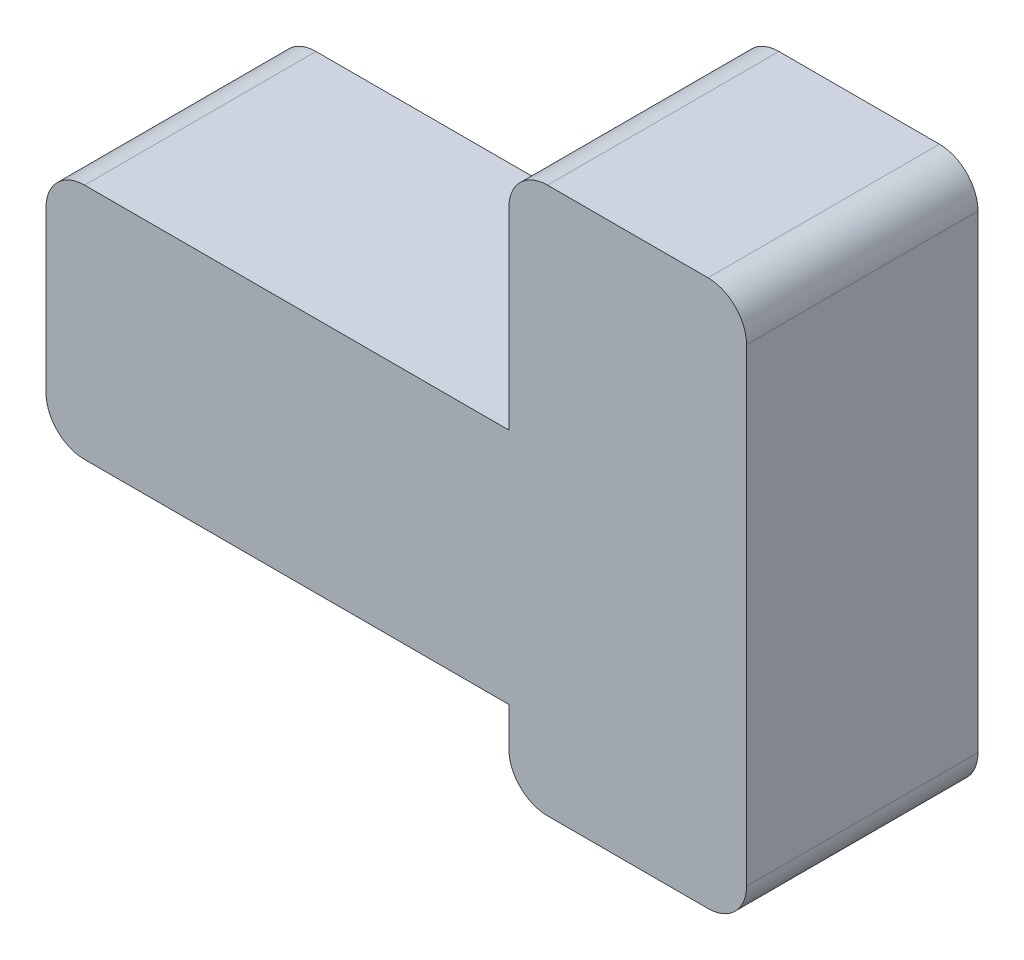
ISO-10303-21;
HEADER;
FILE_DESCRIPTION(('STEP AP214'),'2;1');
FILE_NAME('part.step','',(''),(''),'','','');
FILE_SCHEMA(('AUTOMOTIVE_DESIGN { 1 0 10303 214 1 1 1 1 }'));
ENDSEC;
DATA;
#1=APPLICATION_CONTEXT('core data for automotive mechanical design processes');
#2=APPLICATION_PROTOCOL_DEFINITION('international standard','automotive_design',2000,#1);
#3=PRODUCT_CONTEXT('',#1,'mechanical');
#4=PRODUCT('Part','Part','',(#3));
#5=PRODUCT_RELATED_PRODUCT_CATEGORY('part','',(#4));
#6=PRODUCT_DEFINITION_FORMATION('','',#4);
#7=PRODUCT_DEFINITION_CONTEXT('part definition',#1,'design');
#8=PRODUCT_DEFINITION('design','',#6,#7);
#9=PRODUCT_DEFINITION_SHAPE('','',#8);
#10=(LENGTH_UNIT() NAMED_UNIT(*) SI_UNIT(.MILLI.,.METRE.));
#11=(NAMED_UNIT(*) PLANE_ANGLE_UNIT() SI_UNIT($,.RADIAN.));
#12=(NAMED_UNIT(*) SI_UNIT($,.STERADIAN.) SOLID_ANGLE_UNIT());
#13=UNCERTAINTY_MEASURE_WITH_UNIT(LENGTH_MEASURE(1.E-05),#10,'distance_accuracy_value','');
#14=(GEOMETRIC_REPRESENTATION_CONTEXT(3) GLOBAL_UNCERTAINTY_ASSIGNED_CONTEXT((#13)) GLOBAL_UNIT_ASSIGNED_CONTEXT((#10,
#11,#12)) REPRESENTATION_CONTEXT('',''));
#15=CARTESIAN_POINT('',(0.,0.,0.));
#16=DIRECTION('',(0.,0.,1.));
#17=DIRECTION('',(1.,0.,0.));
#18=AXIS2_PLACEMENT_3D('',#15,#16,#17);
#19=CARTESIAN_POINT('',(-16.0554140728073,4.30942485984491,3.));
#20=DIRECTION('',(1.,0.,0.));
#21=DIRECTION('',(0.,0.,-1.));
#22=AXIS2_PLACEMENT_3D('',#19,#20,#21);
#23=PLANE('',#22);
#24=DIRECTION('',(0.,-1.,0.));
#25=VECTOR('',#24,1.);
#26=CARTESIAN_POINT('',(-16.0554140728073,4.30942485984491,0.));
#27=LINE('',#26,#25);
#28=CARTESIAN_POINT('',(-16.0554140728073,3.80942485984491,0.));
#29=VERTEX_POINT('',#28);
#30=CARTESIAN_POINT('',(-16.0554140728073,1.72942485984491,0.));
#31=VERTEX_POINT('',#30);
#32=EDGE_CURVE('E179',#29,#31,#27,.T.);
#33=ORIENTED_EDGE('',*,*,#32,.T.);
#34=DIRECTION('',(0.,0.,-1.));
#35=VECTOR('',#34,1.);
#36=CARTESIAN_POINT('',(-16.0554140728073,1.72942485984491,3.));
#37=LINE('',#36,#35);
#38=CARTESIAN_POINT('',(-16.0554140728073,1.72942485984491,3.));
#39=VERTEX_POINT('',#38);
#40=EDGE_CURVE('E237',#31,#39,#37,.F.);
#41=ORIENTED_EDGE('',*,*,#40,.T.);
#42=DIRECTION('',(0.,-1.,0.));
#43=VECTOR('',#42,1.);
#44=CARTESIAN_POINT('',(-16.0554140728073,4.30942485984491,3.));
#45=LINE('',#44,#43);
#46=CARTESIAN_POINT('',(-16.0554140728073,3.80942485984491,3.));
#47=VERTEX_POINT('',#46);
#48=EDGE_CURVE('E149',#47,#39,#45,.T.);
#49=ORIENTED_EDGE('',*,*,#48,.F.);
#50=DIRECTION('',(0.,0.,-1.));
#51=VECTOR('',#50,1.);
#52=CARTESIAN_POINT('',(-16.0554140728073,3.80942485984491,3.));
#53=LINE('',#52,#51);
#54=EDGE_CURVE('E234',#47,#29,#53,.T.);
#55=ORIENTED_EDGE('',*,*,#54,.T.);
#56=EDGE_LOOP('',(#33,#41,#49,#55));
#57=FACE_BOUND('',#56,.T.);
#58=ADVANCED_FACE('F33',(#57),#23,.F.);
#59=CARTESIAN_POINT('',(-16.0554140728073,1.22942485984491,3.));
#60=DIRECTION('',(0.,1.,0.));
#61=DIRECTION('',(0.,0.,1.));
#62=AXIS2_PLACEMENT_3D('',#59,#60,#61);
#63=PLANE('',#62);
#64=DIRECTION('',(1.,0.,0.));
#65=VECTOR('',#64,1.);
#66=CARTESIAN_POINT('',(-16.0554140728073,1.22942485984491,3.));
#67=LINE('',#66,#65);
#68=CARTESIAN_POINT('',(-15.5554140728073,1.22942485984491,3.));
#69=VERTEX_POINT('',#68);
#70=CARTESIAN_POINT('',(-10.0554140728073,1.22942485984491,3.));
#71=VERTEX_POINT('',#70);
#72=EDGE_CURVE('E136',#69,#71,#67,.T.);
#73=ORIENTED_EDGE('',*,*,#72,.F.);
#74=DIRECTION('',(0.,0.,-1.));
#75=VECTOR('',#74,1.);
#76=CARTESIAN_POINT('',(-15.5554140728073,1.22942485984491,3.));
#77=LINE('',#76,#75);
#78=CARTESIAN_POINT('',(-15.5554140728073,1.22942485984491,0.));
#79=VERTEX_POINT('',#78);
#80=EDGE_CURVE('E232',#69,#79,#77,.T.);
#81=ORIENTED_EDGE('',*,*,#80,.T.);
#82=DIRECTION('',(1.,0.,0.));
#83=VECTOR('',#82,1.);
#84=CARTESIAN_POINT('',(-16.0554140728073,1.22942485984491,0.));
#85=LINE('',#84,#83);
#86=CARTESIAN_POINT('',(-10.0554140728073,1.22942485984491,0.));
#87=VERTEX_POINT('',#86);
#88=EDGE_CURVE('E155',#79,#87,#85,.T.);
#89=ORIENTED_EDGE('',*,*,#88,.T.);
#90=DIRECTION('',(0.,0.,-1.));
#91=VECTOR('',#90,1.);
#92=CARTESIAN_POINT('',(-10.0554140728073,1.22942485984491,3.));
#93=LINE('',#92,#91);
#94=EDGE_CURVE('E152',#71,#87,#93,.T.);
#95=ORIENTED_EDGE('',*,*,#94,.F.);
#96=EDGE_LOOP('',(#73,#81,#89,#95));
#97=FACE_BOUND('',#96,.T.);
#98=ADVANCED_FACE('F153',(#97),#63,.F.);
#99=CARTESIAN_POINT('',(-10.0554140728073,1.22942485984491,3.));
#100=DIRECTION('',(1.,0.,0.));
#101=DIRECTION('',(0.,0.,-1.));
#102=AXIS2_PLACEMENT_3D('',#99,#100,#101);
#103=PLANE('',#102);
#104=DIRECTION('',(0.,-1.,0.));
#105=VECTOR('',#104,1.);
#106=CARTESIAN_POINT('',(-10.0554140728073,1.22942485984491,0.));
#107=LINE('',#106,#105);
#108=CARTESIAN_POINT('',(-10.0554140728073,0.729424859844906,0.));
#109=VERTEX_POINT('',#108);
#110=EDGE_CURVE('E183',#87,#109,#107,.T.);
#111=ORIENTED_EDGE('',*,*,#110,.T.);
#112=DIRECTION('',(0.,0.,-1.));
#113=VECTOR('',#112,1.);
#114=CARTESIAN_POINT('',(-10.0554140728073,0.729424859844906,3.));
#115=LINE('',#114,#113);
#116=CARTESIAN_POINT('',(-10.0554140728073,0.729424859844906,3.));
#117=VERTEX_POINT('',#116);
#118=EDGE_CURVE('E164',#109,#117,#115,.F.);
#119=ORIENTED_EDGE('',*,*,#118,.T.);
#120=DIRECTION('',(0.,-1.,0.));
#121=VECTOR('',#120,1.);
#122=CARTESIAN_POINT('',(-10.0554140728073,1.22942485984491,3.));
#123=LINE('',#122,#121);
#124=EDGE_CURVE('E141',#71,#117,#123,.T.);
#125=ORIENTED_EDGE('',*,*,#124,.F.);
#126=ORIENTED_EDGE('',*,*,#94,.T.);
#127=EDGE_LOOP('',(#111,#119,#125,#126));
#128=FACE_BOUND('',#127,.T.);
#129=ADVANCED_FACE('F162',(#128),#103,.F.);
#130=CARTESIAN_POINT('',(-10.0554140728073,0.229424859844906,3.));
#131=DIRECTION('',(0.,1.,0.));
#132=DIRECTION('',(0.,0.,1.));
#133=AXIS2_PLACEMENT_3D('',#130,#131,#132);
#134=PLANE('',#133);
#135=DIRECTION('',(1.,0.,0.));
#136=VECTOR('',#135,1.);
#137=CARTESIAN_POINT('',(-10.0554140728073,0.229424859844906,0.));
#138=LINE('',#137,#136);
#139=CARTESIAN_POINT('',(-9.55541407280731,0.229424859844906,0.));
#140=VERTEX_POINT('',#139);
#141=CARTESIAN_POINT('',(-7.47541407280731,0.229424859844906,0.));
#142=VERTEX_POINT('',#141);
#143=EDGE_CURVE('E185',#140,#142,#138,.T.);
#144=ORIENTED_EDGE('',*,*,#143,.T.);
#145=DIRECTION('',(0.,0.,-1.));
#146=VECTOR('',#145,1.);
#147=CARTESIAN_POINT('',(-7.47541407280731,0.229424859844906,3.));
#148=LINE('',#147,#146);
#149=CARTESIAN_POINT('',(-7.47541407280731,0.229424859844906,3.));
#150=VERTEX_POINT('',#149);
#151=EDGE_CURVE('E219',#142,#150,#148,.F.);
#152=ORIENTED_EDGE('',*,*,#151,.T.);
#153=DIRECTION('',(1.,0.,0.));
#154=VECTOR('',#153,1.);
#155=CARTESIAN_POINT('',(-10.0554140728073,0.229424859844906,3.));
#156=LINE('',#155,#154);
#157=CARTESIAN_POINT('',(-9.55541407280731,0.229424859844906,3.));
#158=VERTEX_POINT('',#157);
#159=EDGE_CURVE('E165',#158,#150,#156,.T.);
#160=ORIENTED_EDGE('',*,*,#159,.F.);
#161=DIRECTION('',(0.,0.,-1.));
#162=VECTOR('',#161,1.);
#163=CARTESIAN_POINT('',(-9.55541407280731,0.229424859844906,3.));
#164=LINE('',#163,#162);
#165=EDGE_CURVE('E216',#158,#140,#164,.T.);
#166=ORIENTED_EDGE('',*,*,#165,.T.);
#167=EDGE_LOOP('',(#144,#152,#160,#166));
#168=FACE_BOUND('',#167,.T.);
#169=ADVANCED_FACE('F382',(#168),#134,.F.);
#170=CARTESIAN_POINT('',(-6.97541407280731,0.229424859844906,3.));
#171=DIRECTION('',(-1.,0.,0.));
#172=DIRECTION('',(0.,0.,1.));
#173=AXIS2_PLACEMENT_3D('',#170,#171,#172);
#174=PLANE('',#173);
#175=DIRECTION('',(0.,1.,0.));
#176=VECTOR('',#175,1.);
#177=CARTESIAN_POINT('',(-6.97541407280731,0.229424859844906,3.));
#178=LINE('',#177,#176);
#179=CARTESIAN_POINT('',(-6.97541407280731,0.729424859844906,3.));
#180=VERTEX_POINT('',#179);
#181=CARTESIAN_POINT('',(-6.97541407280731,6.80942485984491,3.));
#182=VERTEX_POINT('',#181);
#183=EDGE_CURVE('E167',#180,#182,#178,.T.);
#184=ORIENTED_EDGE('',*,*,#183,.F.);
#185=DIRECTION('',(0.,0.,-1.));
#186=VECTOR('',#185,1.);
#187=CARTESIAN_POINT('',(-6.97541407280731,0.729424859844906,3.));
#188=LINE('',#187,#186);
#189=CARTESIAN_POINT('',(-6.97541407280731,0.729424859844906,0.));
#190=VERTEX_POINT('',#189);
#191=EDGE_CURVE('E201',#180,#190,#188,.T.);
#192=ORIENTED_EDGE('',*,*,#191,.T.);
#193=DIRECTION('',(0.,1.,0.));
#194=VECTOR('',#193,1.);
#195=CARTESIAN_POINT('',(-6.97541407280731,0.229424859844906,0.));
#196=LINE('',#195,#194);
#197=CARTESIAN_POINT('',(-6.97541407280731,6.80942485984491,0.));
#198=VERTEX_POINT('',#197);
#199=EDGE_CURVE('E188',#190,#198,#196,.T.);
#200=ORIENTED_EDGE('',*,*,#199,.T.);
#201=DIRECTION('',(0.,0.,-1.));
#202=VECTOR('',#201,1.);
#203=CARTESIAN_POINT('',(-6.97541407280731,6.80942485984491,3.));
#204=LINE('',#203,#202);
#205=EDGE_CURVE('E159',#198,#182,#204,.F.);
#206=ORIENTED_EDGE('',*,*,#205,.T.);
#207=EDGE_LOOP('',(#184,#192,#200,#206));
#208=FACE_BOUND('',#207,.T.);
#209=ADVANCED_FACE('F302',(#208),#174,.F.);
#210=CARTESIAN_POINT('',(-6.97541407280731,7.30942485984491,3.));
#211=DIRECTION('',(0.,-1.,0.));
#212=DIRECTION('',(1.,0.,0.));
#213=AXIS2_PLACEMENT_3D('',#210,#211,#212);
#214=PLANE('',#213);
#215=DIRECTION('',(-1.,0.,0.));
#216=VECTOR('',#215,1.);
#217=CARTESIAN_POINT('',(-6.97541407280731,7.30942485984491,3.));
#218=LINE('',#217,#216);
#219=CARTESIAN_POINT('',(-7.47541407280731,7.30942485984491,3.));
#220=VERTEX_POINT('',#219);
#221=CARTESIAN_POINT('',(-9.5554140728073,7.30942485984491,3.));
#222=VERTEX_POINT('',#221);
#223=EDGE_CURVE('E173',#220,#222,#218,.T.);
#224=ORIENTED_EDGE('',*,*,#223,.F.);
#225=DIRECTION('',(0.,0.,-1.));
#226=VECTOR('',#225,1.);
#227=CARTESIAN_POINT('',(-7.47541407280731,7.30942485984491,3.));
#228=LINE('',#227,#226);
#229=CARTESIAN_POINT('',(-7.47541407280731,7.30942485984491,0.));
#230=VERTEX_POINT('',#229);
#231=EDGE_CURVE('E41',#220,#230,#228,.T.);
#232=ORIENTED_EDGE('',*,*,#231,.T.);
#233=DIRECTION('',(-1.,0.,0.));
#234=VECTOR('',#233,1.);
#235=CARTESIAN_POINT('',(-6.97541407280731,7.30942485984491,0.));
#236=LINE('',#235,#234);
#237=CARTESIAN_POINT('',(-9.5554140728073,7.30942485984491,0.));
#238=VERTEX_POINT('',#237);
#239=EDGE_CURVE('E191',#230,#238,#236,.T.);
#240=ORIENTED_EDGE('',*,*,#239,.T.);
#241=DIRECTION('',(0.,0.,-1.));
#242=VECTOR('',#241,1.);
#243=CARTESIAN_POINT('',(-9.5554140728073,7.30942485984491,3.));
#244=LINE('',#243,#242);
#245=EDGE_CURVE('E240',#238,#222,#244,.F.);
#246=ORIENTED_EDGE('',*,*,#245,.T.);
#247=EDGE_LOOP('',(#224,#232,#240,#246));
#248=FACE_BOUND('',#247,.T.);
#249=ADVANCED_FACE('F246',(#248),#214,.F.);
#250=CARTESIAN_POINT('',(-10.0554140728073,7.30942485984491,3.));
#251=DIRECTION('',(1.,0.,0.));
#252=DIRECTION('',(0.,1.,0.));
#253=AXIS2_PLACEMENT_3D('',#250,#251,#252);
#254=PLANE('',#253);
#255=DIRECTION('',(0.,-1.,0.));
#256=VECTOR('',#255,1.);
#257=CARTESIAN_POINT('',(-10.0554140728073,7.30942485984491,3.));
#258=LINE('',#257,#256);
#259=CARTESIAN_POINT('',(-10.0554140728073,6.80942485984491,3.));
#260=VERTEX_POINT('',#259);
#261=CARTESIAN_POINT('',(-10.0554140728073,4.30942485984491,3.));
#262=VERTEX_POINT('',#261);
#263=EDGE_CURVE('E175',#260,#262,#258,.T.);
#264=ORIENTED_EDGE('',*,*,#263,.F.);
#265=DIRECTION('',(0.,0.,-1.));
#266=VECTOR('',#265,1.);
#267=CARTESIAN_POINT('',(-10.0554140728073,6.80942485984491,3.));
#268=LINE('',#267,#266);
#269=CARTESIAN_POINT('',(-10.0554140728073,6.80942485984491,0.));
#270=VERTEX_POINT('',#269);
#271=EDGE_CURVE('E11',#260,#270,#268,.T.);
#272=ORIENTED_EDGE('',*,*,#271,.T.);
#273=DIRECTION('',(0.,-1.,0.));
#274=VECTOR('',#273,1.);
#275=CARTESIAN_POINT('',(-10.0554140728073,7.30942485984491,0.));
#276=LINE('',#275,#274);
#277=CARTESIAN_POINT('',(-10.0554140728073,4.30942485984491,0.));
#278=VERTEX_POINT('',#277);
#279=EDGE_CURVE('E194',#270,#278,#276,.T.);
#280=ORIENTED_EDGE('',*,*,#279,.T.);
#281=DIRECTION('',(0.,0.,-1.));
#282=VECTOR('',#281,1.);
#283=CARTESIAN_POINT('',(-10.0554140728073,4.30942485984491,3.));
#284=LINE('',#283,#282);
#285=EDGE_CURVE('E160',#262,#278,#284,.T.);
#286=ORIENTED_EDGE('',*,*,#285,.F.);
#287=EDGE_LOOP('',(#264,#272,#280,#286));
#288=FACE_BOUND('',#287,.T.);
#289=ADVANCED_FACE('F258',(#288),#254,.F.);
#290=CARTESIAN_POINT('',(-10.0554140728073,4.30942485984491,3.));
#291=DIRECTION('',(0.,-1.,0.));
#292=DIRECTION('',(1.,0.,0.));
#293=AXIS2_PLACEMENT_3D('',#290,#291,#292);
#294=PLANE('',#293);
#295=DIRECTION('',(-1.,0.,0.));
#296=VECTOR('',#295,1.);
#297=CARTESIAN_POINT('',(-10.0554140728073,4.30942485984491,0.));
#298=LINE('',#297,#296);
#299=CARTESIAN_POINT('',(-15.5554140728073,4.30942485984491,0.));
#300=VERTEX_POINT('',#299);
#301=EDGE_CURVE('E196',#278,#300,#298,.T.);
#302=ORIENTED_EDGE('',*,*,#301,.T.);
#303=DIRECTION('',(0.,0.,-1.));
#304=VECTOR('',#303,1.);
#305=CARTESIAN_POINT('',(-15.5554140728073,4.30942485984491,3.));
#306=LINE('',#305,#304);
#307=CARTESIAN_POINT('',(-15.5554140728073,4.30942485984491,3.));
#308=VERTEX_POINT('',#307);
#309=EDGE_CURVE('E48',#300,#308,#306,.F.);
#310=ORIENTED_EDGE('',*,*,#309,.T.);
#311=DIRECTION('',(-1.,0.,0.));
#312=VECTOR('',#311,1.);
#313=CARTESIAN_POINT('',(-10.0554140728073,4.30942485984491,3.));
#314=LINE('',#313,#312);
#315=EDGE_CURVE('E177',#262,#308,#314,.T.);
#316=ORIENTED_EDGE('',*,*,#315,.F.);
#317=ORIENTED_EDGE('',*,*,#285,.T.);
#318=EDGE_LOOP('',(#302,#310,#316,#317));
#319=FACE_BOUND('',#318,.T.);
#320=ADVANCED_FACE('F349',(#319),#294,.F.);
#321=CARTESIAN_POINT('',(0.,0.,3.));
#322=DIRECTION('',(0.,0.,1.));
#323=DIRECTION('',(1.,0.,0.));
#324=AXIS2_PLACEMENT_3D('',#321,#322,#323);
#325=PLANE('',#324);
#326=ORIENTED_EDGE('',*,*,#159,.T.);
#327=CARTESIAN_POINT('',(-7.47541407280731,0.729424859844906,3.));
#328=DIRECTION('',(0.,0.,1.));
#329=DIRECTION('',(1.,0.,0.));
#330=AXIS2_PLACEMENT_3D('',#327,#328,#329);
#331=CIRCLE('',#330,0.5);
#332=EDGE_CURVE('E229',#150,#180,#331,.T.);
#333=ORIENTED_EDGE('',*,*,#332,.T.);
#334=ORIENTED_EDGE('',*,*,#183,.T.);
#335=CARTESIAN_POINT('',(-7.47541407280731,6.80942485984491,3.));
#336=DIRECTION('',(0.,0.,1.));
#337=DIRECTION('',(1.,0.,0.));
#338=AXIS2_PLACEMENT_3D('',#335,#336,#337);
#339=CIRCLE('',#338,0.5);
#340=EDGE_CURVE('E222',#182,#220,#339,.T.);
#341=ORIENTED_EDGE('',*,*,#340,.T.);
#342=ORIENTED_EDGE('',*,*,#223,.T.);
#343=CARTESIAN_POINT('',(-9.5554140728073,6.80942485984491,3.));
#344=DIRECTION('',(0.,0.,1.));
#345=DIRECTION('',(1.,0.,0.));
#346=AXIS2_PLACEMENT_3D('',#343,#344,#345);
#347=CIRCLE('',#346,0.5);
#348=EDGE_CURVE('E56',#222,#260,#347,.T.);
#349=ORIENTED_EDGE('',*,*,#348,.T.);
#350=ORIENTED_EDGE('',*,*,#263,.T.);
#351=ORIENTED_EDGE('',*,*,#315,.T.);
#352=CARTESIAN_POINT('',(-15.5554140728073,3.80942485984491,3.));
#353=DIRECTION('',(0.,0.,1.));
#354=DIRECTION('',(1.,0.,0.));
#355=AXIS2_PLACEMENT_3D('',#352,#353,#354);
#356=CIRCLE('',#355,0.5);
#357=EDGE_CURVE('E224',#308,#47,#356,.T.);
#358=ORIENTED_EDGE('',*,*,#357,.T.);
#359=ORIENTED_EDGE('',*,*,#48,.T.);
#360=CARTESIAN_POINT('',(-15.5554140728073,1.72942485984491,3.));
#361=DIRECTION('',(0.,0.,1.));
#362=DIRECTION('',(1.,0.,0.));
#363=AXIS2_PLACEMENT_3D('',#360,#361,#362);
#364=CIRCLE('',#363,0.5);
#365=EDGE_CURVE('E145',#39,#69,#364,.T.);
#366=ORIENTED_EDGE('',*,*,#365,.T.);
#367=ORIENTED_EDGE('',*,*,#72,.T.);
#368=ORIENTED_EDGE('',*,*,#124,.T.);
#369=CARTESIAN_POINT('',(-9.55541407280731,0.729424859844906,3.));
#370=DIRECTION('',(0.,0.,1.));
#371=DIRECTION('',(1.,0.,0.));
#372=AXIS2_PLACEMENT_3D('',#369,#370,#371);
#373=CIRCLE('',#372,0.5);
#374=EDGE_CURVE('E227',#117,#158,#373,.T.);
#375=ORIENTED_EDGE('',*,*,#374,.T.);
#376=EDGE_LOOP('',(#326,#333,#334,#341,#342,#349,#350,#351,#358,#359,#366,#367,#368,#375));
#377=FACE_BOUND('',#376,.T.);
#378=ADVANCED_FACE('F139',(#377),#325,.T.);
#379=CARTESIAN_POINT('',(0.,0.,0.));
#380=DIRECTION('',(0.,0.,1.));
#381=DIRECTION('',(1.,0.,0.));
#382=AXIS2_PLACEMENT_3D('',#379,#380,#381);
#383=PLANE('',#382);
#384=ORIENTED_EDGE('',*,*,#199,.F.);
#385=CARTESIAN_POINT('',(-7.47541407280731,0.729424859844906,0.));
#386=DIRECTION('',(0.,0.,1.));
#387=DIRECTION('',(1.,0.,0.));
#388=AXIS2_PLACEMENT_3D('',#385,#386,#387);
#389=CIRCLE('',#388,0.5);
#390=EDGE_CURVE('E214',#190,#142,#389,.F.);
#391=ORIENTED_EDGE('',*,*,#390,.T.);
#392=ORIENTED_EDGE('',*,*,#143,.F.);
#393=CARTESIAN_POINT('',(-9.55541407280731,0.729424859844906,0.));
#394=DIRECTION('',(0.,0.,1.));
#395=DIRECTION('',(1.,0.,0.));
#396=AXIS2_PLACEMENT_3D('',#393,#394,#395);
#397=CIRCLE('',#396,0.5);
#398=EDGE_CURVE('E212',#140,#109,#397,.F.);
#399=ORIENTED_EDGE('',*,*,#398,.T.);
#400=ORIENTED_EDGE('',*,*,#110,.F.);
#401=ORIENTED_EDGE('',*,*,#88,.F.);
#402=CARTESIAN_POINT('',(-15.5554140728073,1.72942485984491,0.));
#403=DIRECTION('',(0.,0.,1.));
#404=DIRECTION('',(1.,0.,0.));
#405=AXIS2_PLACEMENT_3D('',#402,#403,#404);
#406=CIRCLE('',#405,0.5);
#407=EDGE_CURVE('E210',#79,#31,#406,.F.);
#408=ORIENTED_EDGE('',*,*,#407,.T.);
#409=ORIENTED_EDGE('',*,*,#32,.F.);
#410=CARTESIAN_POINT('',(-15.5554140728073,3.80942485984491,0.));
#411=DIRECTION('',(0.,0.,1.));
#412=DIRECTION('',(1.,0.,0.));
#413=AXIS2_PLACEMENT_3D('',#410,#411,#412);
#414=CIRCLE('',#413,0.5);
#415=EDGE_CURVE('E208',#29,#300,#414,.F.);
#416=ORIENTED_EDGE('',*,*,#415,.T.);
#417=ORIENTED_EDGE('',*,*,#301,.F.);
#418=ORIENTED_EDGE('',*,*,#279,.F.);
#419=CARTESIAN_POINT('',(-9.5554140728073,6.80942485984491,0.));
#420=DIRECTION('',(0.,0.,1.));
#421=DIRECTION('',(1.,0.,0.));
#422=AXIS2_PLACEMENT_3D('',#419,#420,#421);
#423=CIRCLE('',#422,0.5);
#424=EDGE_CURVE('E204',#270,#238,#423,.F.);
#425=ORIENTED_EDGE('',*,*,#424,.T.);
#426=ORIENTED_EDGE('',*,*,#239,.F.);
#427=CARTESIAN_POINT('',(-7.47541407280731,6.80942485984491,0.));
#428=DIRECTION('',(0.,0.,1.));
#429=DIRECTION('',(1.,0.,0.));
#430=AXIS2_PLACEMENT_3D('',#427,#428,#429);
#431=CIRCLE('',#430,0.5);
#432=EDGE_CURVE('E206',#230,#198,#431,.F.);
#433=ORIENTED_EDGE('',*,*,#432,.T.);
#434=EDGE_LOOP('',(#384,#391,#392,#399,#400,#401,#408,#409,#416,#417,#418,#425,#426,#433));
#435=FACE_BOUND('',#434,.T.);
#436=ADVANCED_FACE('F252',(#435),#383,.F.);
#437=CARTESIAN_POINT('',(-7.47541407280731,0.729424859844906,3.));
#438=DIRECTION('',(0.,0.,-1.));
#439=DIRECTION('',(-1.,0.,0.));
#440=AXIS2_PLACEMENT_3D('',#437,#438,#439);
#441=CYLINDRICAL_SURFACE('',#440,0.5);
#442=ORIENTED_EDGE('',*,*,#332,.F.);
#443=ORIENTED_EDGE('',*,*,#151,.F.);
#444=ORIENTED_EDGE('',*,*,#390,.F.);
#445=ORIENTED_EDGE('',*,*,#191,.F.);
#446=EDGE_LOOP('',(#442,#443,#444,#445));
#447=FACE_BOUND('',#446,.T.);
#448=ADVANCED_FACE('F279',(#447),#441,.T.);
#449=CARTESIAN_POINT('',(-9.55541407280731,0.729424859844906,3.));
#450=DIRECTION('',(0.,0.,-1.));
#451=DIRECTION('',(-1.,0.,0.));
#452=AXIS2_PLACEMENT_3D('',#449,#450,#451);
#453=CYLINDRICAL_SURFACE('',#452,0.5);
#454=ORIENTED_EDGE('',*,*,#374,.F.);
#455=ORIENTED_EDGE('',*,*,#118,.F.);
#456=ORIENTED_EDGE('',*,*,#398,.F.);
#457=ORIENTED_EDGE('',*,*,#165,.F.);
#458=EDGE_LOOP('',(#454,#455,#456,#457));
#459=FACE_BOUND('',#458,.T.);
#460=ADVANCED_FACE('F271',(#459),#453,.T.);
#461=CARTESIAN_POINT('',(-15.5554140728073,1.72942485984491,3.));
#462=DIRECTION('',(0.,0.,-1.));
#463=DIRECTION('',(-1.,0.,0.));
#464=AXIS2_PLACEMENT_3D('',#461,#462,#463);
#465=CYLINDRICAL_SURFACE('',#464,0.5);
#466=ORIENTED_EDGE('',*,*,#365,.F.);
#467=ORIENTED_EDGE('',*,*,#40,.F.);
#468=ORIENTED_EDGE('',*,*,#407,.F.);
#469=ORIENTED_EDGE('',*,*,#80,.F.);
#470=EDGE_LOOP('',(#466,#467,#468,#469));
#471=FACE_BOUND('',#470,.T.);
#472=ADVANCED_FACE('F269',(#471),#465,.T.);
#473=CARTESIAN_POINT('',(-15.5554140728073,3.80942485984491,3.));
#474=DIRECTION('',(0.,0.,-1.));
#475=DIRECTION('',(-1.,0.,0.));
#476=AXIS2_PLACEMENT_3D('',#473,#474,#475);
#477=CYLINDRICAL_SURFACE('',#476,0.5);
#478=ORIENTED_EDGE('',*,*,#357,.F.);
#479=ORIENTED_EDGE('',*,*,#309,.F.);
#480=ORIENTED_EDGE('',*,*,#415,.F.);
#481=ORIENTED_EDGE('',*,*,#54,.F.);
#482=EDGE_LOOP('',(#478,#479,#480,#481));
#483=FACE_BOUND('',#482,.T.);
#484=ADVANCED_FACE('F264',(#483),#477,.T.);
#485=CARTESIAN_POINT('',(-7.47541407280731,6.80942485984491,3.));
#486=DIRECTION('',(0.,0.,-1.));
#487=DIRECTION('',(-1.,0.,0.));
#488=AXIS2_PLACEMENT_3D('',#485,#486,#487);
#489=CYLINDRICAL_SURFACE('',#488,0.5);
#490=ORIENTED_EDGE('',*,*,#340,.F.);
#491=ORIENTED_EDGE('',*,*,#205,.F.);
#492=ORIENTED_EDGE('',*,*,#432,.F.);
#493=ORIENTED_EDGE('',*,*,#231,.F.);
#494=EDGE_LOOP('',(#490,#491,#492,#493));
#495=FACE_BOUND('',#494,.T.);
#496=ADVANCED_FACE('F277',(#495),#489,.T.);
#497=CARTESIAN_POINT('',(-9.5554140728073,6.80942485984491,3.));
#498=DIRECTION('',(0.,0.,-1.));
#499=DIRECTION('',(-1.,0.,0.));
#500=AXIS2_PLACEMENT_3D('',#497,#498,#499);
#501=CYLINDRICAL_SURFACE('',#500,0.5);
#502=ORIENTED_EDGE('',*,*,#348,.F.);
#503=ORIENTED_EDGE('',*,*,#245,.F.);
#504=ORIENTED_EDGE('',*,*,#424,.F.);
#505=ORIENTED_EDGE('',*,*,#271,.F.);
#506=EDGE_LOOP('',(#502,#503,#504,#505));
#507=FACE_BOUND('',#506,.T.);
#508=ADVANCED_FACE('F35',(#507),#501,.T.);
#509=CLOSED_SHELL('',(#58,#98,#129,#169,#209,#249,#289,#320,#378,#436,#448,#460,#472,#484,#496,#508));
#510=MANIFOLD_SOLID_BREP('B2',#509);
#511=ADVANCED_BREP_SHAPE_REPRESENTATION('',(#18,#510),#14);
#512=SHAPE_DEFINITION_REPRESENTATION(#9,#511);
ENDSEC;
END-ISO-10303-21;
